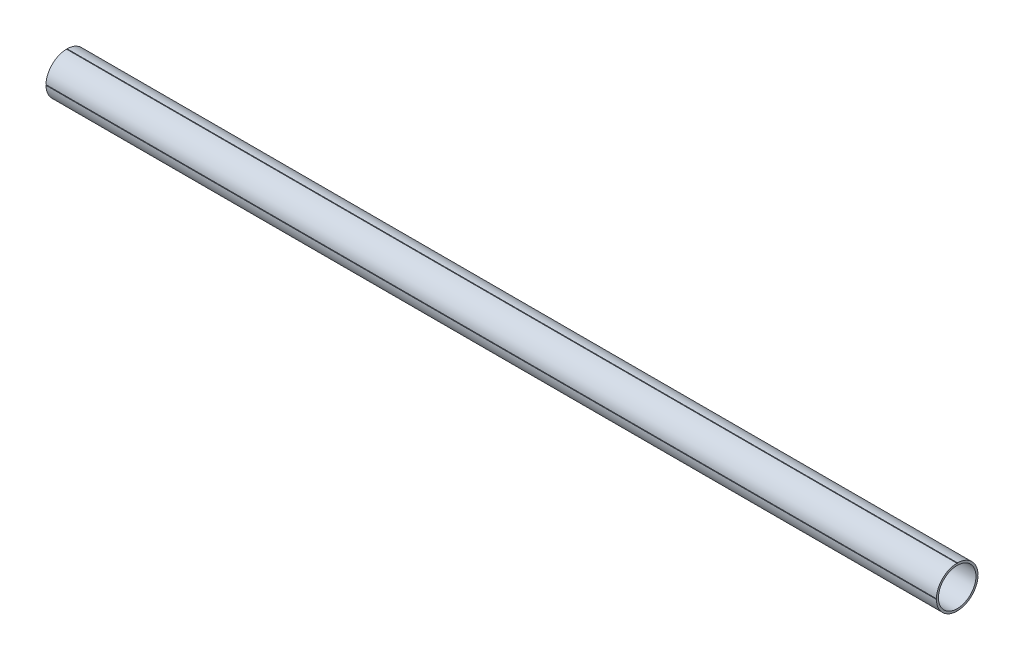
ISO-10303-21;
HEADER;
FILE_DESCRIPTION(('STEP AP214'),'2;1');
FILE_NAME('part.step','',(''),(''),'','','');
FILE_SCHEMA(('AUTOMOTIVE_DESIGN { 1 0 10303 214 1 1 1 1 }'));
ENDSEC;
DATA;
#1=APPLICATION_CONTEXT('core data for automotive mechanical design processes');
#2=APPLICATION_PROTOCOL_DEFINITION('international standard','automotive_design',2000,#1);
#3=PRODUCT_CONTEXT('',#1,'mechanical');
#4=PRODUCT('Part','Part','',(#3));
#5=PRODUCT_RELATED_PRODUCT_CATEGORY('part','',(#4));
#6=PRODUCT_DEFINITION_FORMATION('','',#4);
#7=PRODUCT_DEFINITION_CONTEXT('part definition',#1,'design');
#8=PRODUCT_DEFINITION('design','',#6,#7);
#9=PRODUCT_DEFINITION_SHAPE('','',#8);
#10=(LENGTH_UNIT() NAMED_UNIT(*) SI_UNIT(.MILLI.,.METRE.));
#11=(NAMED_UNIT(*) PLANE_ANGLE_UNIT() SI_UNIT($,.RADIAN.));
#12=(NAMED_UNIT(*) SI_UNIT($,.STERADIAN.) SOLID_ANGLE_UNIT());
#13=UNCERTAINTY_MEASURE_WITH_UNIT(LENGTH_MEASURE(1.E-05),#10,'distance_accuracy_value','');
#14=(GEOMETRIC_REPRESENTATION_CONTEXT(3) GLOBAL_UNCERTAINTY_ASSIGNED_CONTEXT((#13)) GLOBAL_UNIT_ASSIGNED_CONTEXT((#10,
#11,#12)) REPRESENTATION_CONTEXT('',''));
#15=CARTESIAN_POINT('',(0.,0.,0.));
#16=DIRECTION('',(0.,0.,1.));
#17=DIRECTION('',(1.,0.,0.));
#18=AXIS2_PLACEMENT_3D('',#15,#16,#17);
#19=CARTESIAN_POINT('',(-457.2,-15.575,0.));
#20=DIRECTION('',(0.,0.642669912093643,0.76614318771986));
#21=DIRECTION('',(0.,-0.76614318771986,0.642669912093643));
#22=AXIS2_PLACEMENT_3D('',#19,#20,#21);
#23=PLANE('',#22);
#24=DIRECTION('',(0.,0.766143187719856,-0.642669912093648));
#25=VECTOR('',#24,1.);
#26=CARTESIAN_POINT('',(222.25,-15.8730313740004,0.250000000000002));
#27=LINE('',#26,#25);
#28=CARTESIAN_POINT('',(222.25,-15.8730313740004,0.250000000000002));
#29=VERTEX_POINT('',#28);
#30=CARTESIAN_POINT('',(222.25,-15.575,0.));
#31=VERTEX_POINT('',#30);
#32=EDGE_CURVE('E220',#29,#31,#27,.T.);
#33=ORIENTED_EDGE('',*,*,#32,.F.);
#34=DIRECTION('',(-1.,0.,0.));
#35=VECTOR('',#34,1.);
#36=CARTESIAN_POINT('',(457.2,-15.8730313740004,0.249999999999996));
#37=LINE('',#36,#35);
#38=CARTESIAN_POINT('',(-457.2,-15.8730313740004,0.249999999999998));
#39=VERTEX_POINT('',#38);
#40=EDGE_CURVE('E131',#39,#29,#37,.F.);
#41=ORIENTED_EDGE('',*,*,#40,.F.);
#42=DIRECTION('',(0.,0.76614318771986,-0.642669912093643));
#43=VECTOR('',#42,1.);
#44=CARTESIAN_POINT('',(-457.2,-15.8730313740004,0.249999999999999));
#45=LINE('',#44,#43);
#46=CARTESIAN_POINT('',(-457.2,-15.575,0.));
#47=VERTEX_POINT('',#46);
#48=EDGE_CURVE('E166',#39,#47,#45,.T.);
#49=ORIENTED_EDGE('',*,*,#48,.T.);
#50=DIRECTION('',(1.,0.,0.));
#51=VECTOR('',#50,1.);
#52=CARTESIAN_POINT('',(-457.2,-15.575,0.));
#53=LINE('',#52,#51);
#54=EDGE_CURVE('E61',#47,#31,#53,.T.);
#55=ORIENTED_EDGE('',*,*,#54,.T.);
#56=EDGE_LOOP('',(#33,#41,#49,#55));
#57=FACE_BOUND('',#56,.T.);
#58=ADVANCED_FACE('F36',(#57),#23,.F.);
#59=CARTESIAN_POINT('',(-457.2,-15.8730313740004,-0.250000000000002));
#60=DIRECTION('',(0.,0.642669912093652,-0.766143187719853));
#61=DIRECTION('',(0.,0.766143187719853,0.642669912093652));
#62=AXIS2_PLACEMENT_3D('',#59,#60,#61);
#63=PLANE('',#62);
#64=DIRECTION('',(0.,-0.766143187719854,-0.642669912093651));
#65=VECTOR('',#64,1.);
#66=CARTESIAN_POINT('',(222.25,-15.575,0.));
#67=LINE('',#66,#65);
#68=CARTESIAN_POINT('',(222.25,-15.8730313740004,-0.250000000000004));
#69=VERTEX_POINT('',#68);
#70=EDGE_CURVE('E217',#31,#69,#67,.T.);
#71=ORIENTED_EDGE('',*,*,#70,.F.);
#72=ORIENTED_EDGE('',*,*,#54,.F.);
#73=DIRECTION('',(0.,-0.766143187719849,-0.642669912093657));
#74=VECTOR('',#73,1.);
#75=CARTESIAN_POINT('',(-457.2,-15.575,0.));
#76=LINE('',#75,#74);
#77=CARTESIAN_POINT('',(-457.2,-15.8730313740004,-0.250000000000003));
#78=VERTEX_POINT('',#77);
#79=EDGE_CURVE('E44',#47,#78,#76,.T.);
#80=ORIENTED_EDGE('',*,*,#79,.T.);
#81=DIRECTION('',(-1.,0.,0.));
#82=VECTOR('',#81,1.);
#83=CARTESIAN_POINT('',(457.2,-15.8730313740004,-0.250000000000002));
#84=LINE('',#83,#82);
#85=EDGE_CURVE('E157',#69,#78,#84,.T.);
#86=ORIENTED_EDGE('',*,*,#85,.F.);
#87=EDGE_LOOP('',(#71,#72,#80,#86));
#88=FACE_BOUND('',#87,.T.);
#89=ADVANCED_FACE('F282',(#88),#63,.F.);
#90=CARTESIAN_POINT('',(457.2,0.,0.));
#91=DIRECTION('',(-1.,0.,0.));
#92=DIRECTION('',(0.,0.,1.));
#93=AXIS2_PLACEMENT_3D('',#90,#91,#92);
#94=CYLINDRICAL_SURFACE('',#93,15.875);
#95=DIRECTION('',(1.,0.,0.));
#96=VECTOR('',#95,1.);
#97=CARTESIAN_POINT('',(-457.2,-0.250000000000055,-15.8730313740004));
#98=LINE('',#97,#96);
#99=CARTESIAN_POINT('',(-457.2,-0.250000000000055,-15.8730313740004));
#100=VERTEX_POINT('',#99);
#101=CARTESIAN_POINT('',(222.25,-0.250000000000059,-15.8730313740004));
#102=VERTEX_POINT('',#101);
#103=EDGE_CURVE('E95',#100,#102,#98,.T.);
#104=ORIENTED_EDGE('',*,*,#103,.T.);
#105=CARTESIAN_POINT('',(222.25,0.,0.));
#106=DIRECTION('',(1.,0.,0.));
#107=DIRECTION('',(0.,0.,-1.));
#108=AXIS2_PLACEMENT_3D('',#105,#106,#107);
#109=CIRCLE('',#108,15.875);
#110=EDGE_CURVE('E214',#69,#102,#109,.T.);
#111=ORIENTED_EDGE('',*,*,#110,.F.);
#112=ORIENTED_EDGE('',*,*,#85,.T.);
#113=CARTESIAN_POINT('',(-457.2,0.,0.));
#114=DIRECTION('',(-1.,0.,0.));
#115=DIRECTION('',(0.,0.,1.));
#116=AXIS2_PLACEMENT_3D('',#113,#114,#115);
#117=CIRCLE('',#116,15.875);
#118=EDGE_CURVE('E39',#78,#100,#117,.F.);
#119=ORIENTED_EDGE('',*,*,#118,.T.);
#120=EDGE_LOOP('',(#104,#111,#112,#119));
#121=FACE_BOUND('',#120,.T.);
#122=ADVANCED_FACE('F280',(#121),#94,.T.);
#123=CARTESIAN_POINT('',(-457.2,0.,-15.575));
#124=DIRECTION('',(0.,-0.766143187719858,0.642669912093646));
#125=DIRECTION('',(0.,-0.642669912093646,-0.766143187719858));
#126=AXIS2_PLACEMENT_3D('',#123,#124,#125);
#127=PLANE('',#126);
#128=DIRECTION('',(0.,0.642669912093652,0.766143187719852));
#129=VECTOR('',#128,1.);
#130=CARTESIAN_POINT('',(222.25,-0.250000000000059,-15.8730313740004));
#131=LINE('',#130,#129);
#132=CARTESIAN_POINT('',(222.25,0.,-15.575));
#133=VERTEX_POINT('',#132);
#134=EDGE_CURVE('E211',#102,#133,#131,.T.);
#135=ORIENTED_EDGE('',*,*,#134,.F.);
#136=ORIENTED_EDGE('',*,*,#103,.F.);
#137=DIRECTION('',(0.,0.642669912093645,0.766143187719859));
#138=VECTOR('',#137,1.);
#139=CARTESIAN_POINT('',(-457.2,-0.250000000000054,-15.8730313740004));
#140=LINE('',#139,#138);
#141=CARTESIAN_POINT('',(-457.2,0.,-15.575));
#142=VERTEX_POINT('',#141);
#143=EDGE_CURVE('E117',#100,#142,#140,.T.);
#144=ORIENTED_EDGE('',*,*,#143,.T.);
#145=DIRECTION('',(1.,0.,0.));
#146=VECTOR('',#145,1.);
#147=CARTESIAN_POINT('',(-457.2,0.,-15.575));
#148=LINE('',#147,#146);
#149=EDGE_CURVE('E102',#142,#133,#148,.T.);
#150=ORIENTED_EDGE('',*,*,#149,.T.);
#151=EDGE_LOOP('',(#135,#136,#144,#150));
#152=FACE_BOUND('',#151,.T.);
#153=ADVANCED_FACE('F123',(#152),#127,.F.);
#154=CARTESIAN_POINT('',(-457.2,0.249999999999946,-15.8730313740004));
#155=DIRECTION('',(0.,0.766143187719855,0.642669912093649));
#156=DIRECTION('',(0.,-0.642669912093649,0.766143187719855));
#157=AXIS2_PLACEMENT_3D('',#154,#155,#156);
#158=PLANE('',#157);
#159=DIRECTION('',(0.,0.642669912093647,-0.766143187719857));
#160=VECTOR('',#159,1.);
#161=CARTESIAN_POINT('',(222.25,0.,-15.575));
#162=LINE('',#161,#160);
#163=CARTESIAN_POINT('',(222.25,0.249999999999947,-15.8730313740004));
#164=VERTEX_POINT('',#163);
#165=EDGE_CURVE('E109',#133,#164,#162,.T.);
#166=ORIENTED_EDGE('',*,*,#165,.F.);
#167=ORIENTED_EDGE('',*,*,#149,.F.);
#168=DIRECTION('',(0.,0.642669912093646,-0.766143187719858));
#169=VECTOR('',#168,1.);
#170=CARTESIAN_POINT('',(-457.2,0.,-15.575));
#171=LINE('',#170,#169);
#172=CARTESIAN_POINT('',(-457.2,0.249999999999946,-15.8730313740004));
#173=VERTEX_POINT('',#172);
#174=EDGE_CURVE('E106',#142,#173,#171,.T.);
#175=ORIENTED_EDGE('',*,*,#174,.T.);
#176=DIRECTION('',(-1.,0.,0.));
#177=VECTOR('',#176,1.);
#178=CARTESIAN_POINT('',(457.2,0.249999999999944,-15.8730313740004));
#179=LINE('',#178,#177);
#180=EDGE_CURVE('E110',#164,#173,#179,.T.);
#181=ORIENTED_EDGE('',*,*,#180,.F.);
#182=EDGE_LOOP('',(#166,#167,#175,#181));
#183=FACE_BOUND('',#182,.T.);
#184=ADVANCED_FACE('F104',(#183),#158,.F.);
#185=CARTESIAN_POINT('',(457.2,0.,0.));
#186=DIRECTION('',(-1.,0.,0.));
#187=DIRECTION('',(0.,0.,1.));
#188=AXIS2_PLACEMENT_3D('',#185,#186,#187);
#189=CYLINDRICAL_SURFACE('',#188,15.875);
#190=DIRECTION('',(1.,0.,0.));
#191=VECTOR('',#190,1.);
#192=CARTESIAN_POINT('',(-457.2,15.8730313740004,-0.249999999999999));
#193=LINE('',#192,#191);
#194=CARTESIAN_POINT('',(-457.2,15.8730313740004,-0.249999999999999));
#195=VERTEX_POINT('',#194);
#196=CARTESIAN_POINT('',(222.25,15.8730313740004,-0.25));
#197=VERTEX_POINT('',#196);
#198=EDGE_CURVE('E148',#195,#197,#193,.T.);
#199=ORIENTED_EDGE('',*,*,#198,.T.);
#200=CARTESIAN_POINT('',(222.25,0.,0.));
#201=DIRECTION('',(1.,0.,0.));
#202=DIRECTION('',(0.,0.,-1.));
#203=AXIS2_PLACEMENT_3D('',#200,#201,#202);
#204=CIRCLE('',#203,15.875);
#205=EDGE_CURVE('E207',#164,#197,#204,.T.);
#206=ORIENTED_EDGE('',*,*,#205,.F.);
#207=ORIENTED_EDGE('',*,*,#180,.T.);
#208=CARTESIAN_POINT('',(-457.2,0.,0.));
#209=DIRECTION('',(-1.,0.,0.));
#210=DIRECTION('',(0.,0.,1.));
#211=AXIS2_PLACEMENT_3D('',#208,#209,#210);
#212=CIRCLE('',#211,15.875);
#213=EDGE_CURVE('E121',#173,#195,#212,.F.);
#214=ORIENTED_EDGE('',*,*,#213,.T.);
#215=EDGE_LOOP('',(#199,#206,#207,#214));
#216=FACE_BOUND('',#215,.T.);
#217=ADVANCED_FACE('F272',(#216),#189,.T.);
#218=CARTESIAN_POINT('',(-457.2,15.575,0.));
#219=DIRECTION('',(0.,-0.642669912093643,-0.76614318771986));
#220=DIRECTION('',(0.,0.76614318771986,-0.642669912093643));
#221=AXIS2_PLACEMENT_3D('',#218,#219,#220);
#222=PLANE('',#221);
#223=DIRECTION('',(0.,-0.766143187719859,0.642669912093645));
#224=VECTOR('',#223,1.);
#225=CARTESIAN_POINT('',(222.25,15.8730313740004,-0.25));
#226=LINE('',#225,#224);
#227=CARTESIAN_POINT('',(222.25,15.575,0.));
#228=VERTEX_POINT('',#227);
#229=EDGE_CURVE('E204',#197,#228,#226,.T.);
#230=ORIENTED_EDGE('',*,*,#229,.F.);
#231=ORIENTED_EDGE('',*,*,#198,.F.);
#232=DIRECTION('',(0.,-0.76614318771986,0.642669912093643));
#233=VECTOR('',#232,1.);
#234=CARTESIAN_POINT('',(-457.2,15.8730313740004,-0.249999999999999));
#235=LINE('',#234,#233);
#236=CARTESIAN_POINT('',(-457.2,15.575,0.));
#237=VERTEX_POINT('',#236);
#238=EDGE_CURVE('E172',#195,#237,#235,.T.);
#239=ORIENTED_EDGE('',*,*,#238,.T.);
#240=DIRECTION('',(1.,0.,0.));
#241=VECTOR('',#240,1.);
#242=CARTESIAN_POINT('',(-457.2,15.575,0.));
#243=LINE('',#242,#241);
#244=EDGE_CURVE('E145',#237,#228,#243,.T.);
#245=ORIENTED_EDGE('',*,*,#244,.T.);
#246=EDGE_LOOP('',(#230,#231,#239,#245));
#247=FACE_BOUND('',#246,.T.);
#248=ADVANCED_FACE('F269',(#247),#222,.F.);
#249=CARTESIAN_POINT('',(-457.2,15.8730313740004,0.250000000000002));
#250=DIRECTION('',(0.,-0.642669912093652,0.766143187719853));
#251=DIRECTION('',(0.,-0.766143187719853,-0.642669912093652));
#252=AXIS2_PLACEMENT_3D('',#249,#250,#251);
#253=PLANE('',#252);
#254=DIRECTION('',(0.,0.766143187719853,0.642669912093652));
#255=VECTOR('',#254,1.);
#256=CARTESIAN_POINT('',(222.25,15.575,0.));
#257=LINE('',#256,#255);
#258=CARTESIAN_POINT('',(222.25,15.8730313740004,0.250000000000004));
#259=VERTEX_POINT('',#258);
#260=EDGE_CURVE('E201',#228,#259,#257,.T.);
#261=ORIENTED_EDGE('',*,*,#260,.F.);
#262=ORIENTED_EDGE('',*,*,#244,.F.);
#263=DIRECTION('',(0.,0.766143187719856,0.642669912093648));
#264=VECTOR('',#263,1.);
#265=CARTESIAN_POINT('',(-457.2,15.575,0.));
#266=LINE('',#265,#264);
#267=CARTESIAN_POINT('',(-457.2,15.8730313740004,0.250000000000003));
#268=VERTEX_POINT('',#267);
#269=EDGE_CURVE('E171',#237,#268,#266,.T.);
#270=ORIENTED_EDGE('',*,*,#269,.T.);
#271=DIRECTION('',(-1.,0.,0.));
#272=VECTOR('',#271,1.);
#273=CARTESIAN_POINT('',(457.2,15.8730313740004,0.250000000000003));
#274=LINE('',#273,#272);
#275=EDGE_CURVE('E143',#259,#268,#274,.T.);
#276=ORIENTED_EDGE('',*,*,#275,.F.);
#277=EDGE_LOOP('',(#261,#262,#270,#276));
#278=FACE_BOUND('',#277,.T.);
#279=ADVANCED_FACE('F260',(#278),#253,.F.);
#280=CARTESIAN_POINT('',(457.2,0.,0.));
#281=DIRECTION('',(-1.,0.,0.));
#282=DIRECTION('',(0.,0.,1.));
#283=AXIS2_PLACEMENT_3D('',#280,#281,#282);
#284=CYLINDRICAL_SURFACE('',#283,15.875);
#285=DIRECTION('',(1.,0.,0.));
#286=VECTOR('',#285,1.);
#287=CARTESIAN_POINT('',(-457.2,0.250000000000164,15.8730313740004));
#288=LINE('',#287,#286);
#289=CARTESIAN_POINT('',(-457.2,0.250000000000166,15.8730313740004));
#290=VERTEX_POINT('',#289);
#291=CARTESIAN_POINT('',(222.25,0.250000000000163,15.8730313740004));
#292=VERTEX_POINT('',#291);
#293=EDGE_CURVE('E138',#290,#292,#288,.T.);
#294=ORIENTED_EDGE('',*,*,#293,.T.);
#295=CARTESIAN_POINT('',(222.25,0.,0.));
#296=DIRECTION('',(1.,0.,0.));
#297=DIRECTION('',(0.,0.,-1.));
#298=AXIS2_PLACEMENT_3D('',#295,#296,#297);
#299=CIRCLE('',#298,15.875);
#300=EDGE_CURVE('E160',#259,#292,#299,.T.);
#301=ORIENTED_EDGE('',*,*,#300,.F.);
#302=ORIENTED_EDGE('',*,*,#275,.T.);
#303=CARTESIAN_POINT('',(-457.2,0.,0.));
#304=DIRECTION('',(-1.,0.,0.));
#305=DIRECTION('',(0.,0.,1.));
#306=AXIS2_PLACEMENT_3D('',#303,#304,#305);
#307=CIRCLE('',#306,15.875);
#308=EDGE_CURVE('E168',#268,#290,#307,.F.);
#309=ORIENTED_EDGE('',*,*,#308,.T.);
#310=EDGE_LOOP('',(#294,#301,#302,#309));
#311=FACE_BOUND('',#310,.T.);
#312=ADVANCED_FACE('F255',(#311),#284,.T.);
#313=CARTESIAN_POINT('',(-457.2,1.63166570611758E-13,15.575));
#314=DIRECTION('',(0.,0.766143187719853,-0.642669912093651));
#315=DIRECTION('',(0.,0.642669912093651,0.766143187719853));
#316=AXIS2_PLACEMENT_3D('',#313,#314,#315);
#317=PLANE('',#316);
#318=DIRECTION('',(0.,-0.642669912093649,-0.766143187719855));
#319=VECTOR('',#318,1.);
#320=CARTESIAN_POINT('',(222.25,0.250000000000163,15.8730313740004));
#321=LINE('',#320,#319);
#322=CARTESIAN_POINT('',(222.25,1.63246704556676E-13,15.575));
#323=VERTEX_POINT('',#322);
#324=EDGE_CURVE('E226',#292,#323,#321,.T.);
#325=ORIENTED_EDGE('',*,*,#324,.F.);
#326=ORIENTED_EDGE('',*,*,#293,.F.);
#327=DIRECTION('',(0.,-0.642669912093654,-0.766143187719851));
#328=VECTOR('',#327,1.);
#329=CARTESIAN_POINT('',(-457.2,0.250000000000165,15.8730313740004));
#330=LINE('',#329,#328);
#331=CARTESIAN_POINT('',(-457.2,1.62648395909034E-13,15.575));
#332=VERTEX_POINT('',#331);
#333=EDGE_CURVE('E170',#290,#332,#330,.T.);
#334=ORIENTED_EDGE('',*,*,#333,.T.);
#335=DIRECTION('',(1.,0.,0.));
#336=VECTOR('',#335,1.);
#337=CARTESIAN_POINT('',(-457.2,1.63551897719438E-13,15.575));
#338=LINE('',#337,#336);
#339=EDGE_CURVE('E134',#332,#323,#338,.T.);
#340=ORIENTED_EDGE('',*,*,#339,.T.);
#341=EDGE_LOOP('',(#325,#326,#334,#340));
#342=FACE_BOUND('',#341,.T.);
#343=ADVANCED_FACE('F248',(#342),#317,.F.);
#344=CARTESIAN_POINT('',(-457.2,-0.249999999999835,15.8730313740004));
#345=DIRECTION('',(0.,-0.76614318771986,-0.642669912093644));
#346=DIRECTION('',(0.,0.642669912093644,-0.76614318771986));
#347=AXIS2_PLACEMENT_3D('',#344,#345,#346);
#348=PLANE('',#347);
#349=DIRECTION('',(0.,-0.642669912093646,0.766143187719858));
#350=VECTOR('',#349,1.);
#351=CARTESIAN_POINT('',(222.25,1.63246704556676E-13,15.575));
#352=LINE('',#351,#350);
#353=CARTESIAN_POINT('',(222.25,-0.249999999999834,15.8730313740004));
#354=VERTEX_POINT('',#353);
#355=EDGE_CURVE('E52',#323,#354,#352,.T.);
#356=ORIENTED_EDGE('',*,*,#355,.F.);
#357=ORIENTED_EDGE('',*,*,#339,.F.);
#358=DIRECTION('',(0.,-0.642669912093641,0.766143187719862));
#359=VECTOR('',#358,1.);
#360=CARTESIAN_POINT('',(-457.2,1.62196645003831E-13,15.575));
#361=LINE('',#360,#359);
#362=CARTESIAN_POINT('',(-457.2,-0.249999999999836,15.8730313740004));
#363=VERTEX_POINT('',#362);
#364=EDGE_CURVE('E167',#332,#363,#361,.T.);
#365=ORIENTED_EDGE('',*,*,#364,.T.);
#366=DIRECTION('',(-1.,0.,0.));
#367=VECTOR('',#366,1.);
#368=CARTESIAN_POINT('',(457.2,-0.249999999999834,15.8730313740004));
#369=LINE('',#368,#367);
#370=EDGE_CURVE('E125',#354,#363,#369,.T.);
#371=ORIENTED_EDGE('',*,*,#370,.F.);
#372=EDGE_LOOP('',(#356,#357,#365,#371));
#373=FACE_BOUND('',#372,.T.);
#374=ADVANCED_FACE('F246',(#373),#348,.F.);
#375=CARTESIAN_POINT('',(457.2,0.,0.));
#376=DIRECTION('',(-1.,0.,0.));
#377=DIRECTION('',(0.,0.,1.));
#378=AXIS2_PLACEMENT_3D('',#375,#376,#377);
#379=CYLINDRICAL_SURFACE('',#378,15.875);
#380=ORIENTED_EDGE('',*,*,#40,.T.);
#381=CARTESIAN_POINT('',(222.25,0.,0.));
#382=DIRECTION('',(1.,0.,0.));
#383=DIRECTION('',(0.,0.,-1.));
#384=AXIS2_PLACEMENT_3D('',#381,#382,#383);
#385=CIRCLE('',#384,15.875);
#386=EDGE_CURVE('E223',#354,#29,#385,.T.);
#387=ORIENTED_EDGE('',*,*,#386,.F.);
#388=ORIENTED_EDGE('',*,*,#370,.T.);
#389=CARTESIAN_POINT('',(-457.2,0.,0.));
#390=DIRECTION('',(-1.,0.,0.));
#391=DIRECTION('',(0.,0.,1.));
#392=AXIS2_PLACEMENT_3D('',#389,#390,#391);
#393=CIRCLE('',#392,15.875);
#394=EDGE_CURVE('E163',#363,#39,#393,.F.);
#395=ORIENTED_EDGE('',*,*,#394,.T.);
#396=EDGE_LOOP('',(#380,#387,#388,#395));
#397=FACE_BOUND('',#396,.T.);
#398=ADVANCED_FACE('F290',(#397),#379,.T.);
#399=CARTESIAN_POINT('',(457.2,0.,0.));
#400=DIRECTION('',(-1.,0.,0.));
#401=DIRECTION('',(0.,0.,1.));
#402=AXIS2_PLACEMENT_3D('',#399,#400,#401);
#403=CYLINDRICAL_SURFACE('',#402,14.3);
#404=CARTESIAN_POINT('',(-457.2,0.,0.));
#405=DIRECTION('',(-1.,0.,0.));
#406=DIRECTION('',(0.,0.,1.));
#407=AXIS2_PLACEMENT_3D('',#404,#405,#406);
#408=CIRCLE('',#407,14.3);
#409=CARTESIAN_POINT('',(-457.2,0.,14.3));
#410=VERTEX_POINT('',#409);
#411=EDGE_CURVE('E11',#410,#410,#408,.F.);
#412=ORIENTED_EDGE('',*,*,#411,.F.);
#413=EDGE_LOOP('',(#412));
#414=FACE_BOUND('',#413,.T.);
#415=CARTESIAN_POINT('',(222.25,0.,0.));
#416=DIRECTION('',(1.,0.,0.));
#417=DIRECTION('',(0.,0.,-1.));
#418=AXIS2_PLACEMENT_3D('',#415,#416,#417);
#419=CIRCLE('',#418,14.3);
#420=CARTESIAN_POINT('',(222.25,0.,-14.3));
#421=VERTEX_POINT('',#420);
#422=EDGE_CURVE('E228',#421,#421,#419,.T.);
#423=ORIENTED_EDGE('',*,*,#422,.T.);
#424=EDGE_LOOP('',(#423));
#425=FACE_BOUND('',#424,.T.);
#426=ADVANCED_FACE('F232',(#414,#425),#403,.F.);
#427=CARTESIAN_POINT('',(-457.2,0.,0.));
#428=DIRECTION('',(1.,0.,0.));
#429=DIRECTION('',(0.,0.,-1.));
#430=AXIS2_PLACEMENT_3D('',#427,#428,#429);
#431=PLANE('',#430);
#432=ORIENTED_EDGE('',*,*,#411,.T.);
#433=EDGE_LOOP('',(#432));
#434=FACE_BOUND('',#433,.T.);
#435=ORIENTED_EDGE('',*,*,#48,.F.);
#436=ORIENTED_EDGE('',*,*,#394,.F.);
#437=ORIENTED_EDGE('',*,*,#364,.F.);
#438=ORIENTED_EDGE('',*,*,#333,.F.);
#439=ORIENTED_EDGE('',*,*,#308,.F.);
#440=ORIENTED_EDGE('',*,*,#269,.F.);
#441=ORIENTED_EDGE('',*,*,#238,.F.);
#442=ORIENTED_EDGE('',*,*,#213,.F.);
#443=ORIENTED_EDGE('',*,*,#174,.F.);
#444=ORIENTED_EDGE('',*,*,#143,.F.);
#445=ORIENTED_EDGE('',*,*,#118,.F.);
#446=ORIENTED_EDGE('',*,*,#79,.F.);
#447=EDGE_LOOP('',(#435,#436,#437,#438,#439,#440,#441,#442,#443,#444,#445,#446));
#448=FACE_BOUND('',#447,.T.);
#449=ADVANCED_FACE('F115',(#434,#448),#431,.F.);
#450=CARTESIAN_POINT('',(222.25,0.,0.));
#451=DIRECTION('',(1.,0.,0.));
#452=DIRECTION('',(0.,0.,-1.));
#453=AXIS2_PLACEMENT_3D('',#450,#451,#452);
#454=PLANE('',#453);
#455=ORIENTED_EDGE('',*,*,#422,.F.);
#456=EDGE_LOOP('',(#455));
#457=FACE_BOUND('',#456,.T.);
#458=ORIENTED_EDGE('',*,*,#324,.T.);
#459=ORIENTED_EDGE('',*,*,#355,.T.);
#460=ORIENTED_EDGE('',*,*,#386,.T.);
#461=ORIENTED_EDGE('',*,*,#32,.T.);
#462=ORIENTED_EDGE('',*,*,#70,.T.);
#463=ORIENTED_EDGE('',*,*,#110,.T.);
#464=ORIENTED_EDGE('',*,*,#134,.T.);
#465=ORIENTED_EDGE('',*,*,#165,.T.);
#466=ORIENTED_EDGE('',*,*,#205,.T.);
#467=ORIENTED_EDGE('',*,*,#229,.T.);
#468=ORIENTED_EDGE('',*,*,#260,.T.);
#469=ORIENTED_EDGE('',*,*,#300,.T.);
#470=EDGE_LOOP('',(#458,#459,#460,#461,#462,#463,#464,#465,#466,#467,#468,#469));
#471=FACE_BOUND('',#470,.T.);
#472=ADVANCED_FACE('F234',(#457,#471),#454,.T.);
#473=CLOSED_SHELL('',(#58,#89,#122,#153,#184,#217,#248,#279,#312,#343,#374,#398,#426,#449,#472));
#474=MANIFOLD_SOLID_BREP('B2',#473);
#475=ADVANCED_BREP_SHAPE_REPRESENTATION('',(#18,#474),#14);
#476=SHAPE_DEFINITION_REPRESENTATION(#9,#475);
ENDSEC;
END-ISO-10303-21;
